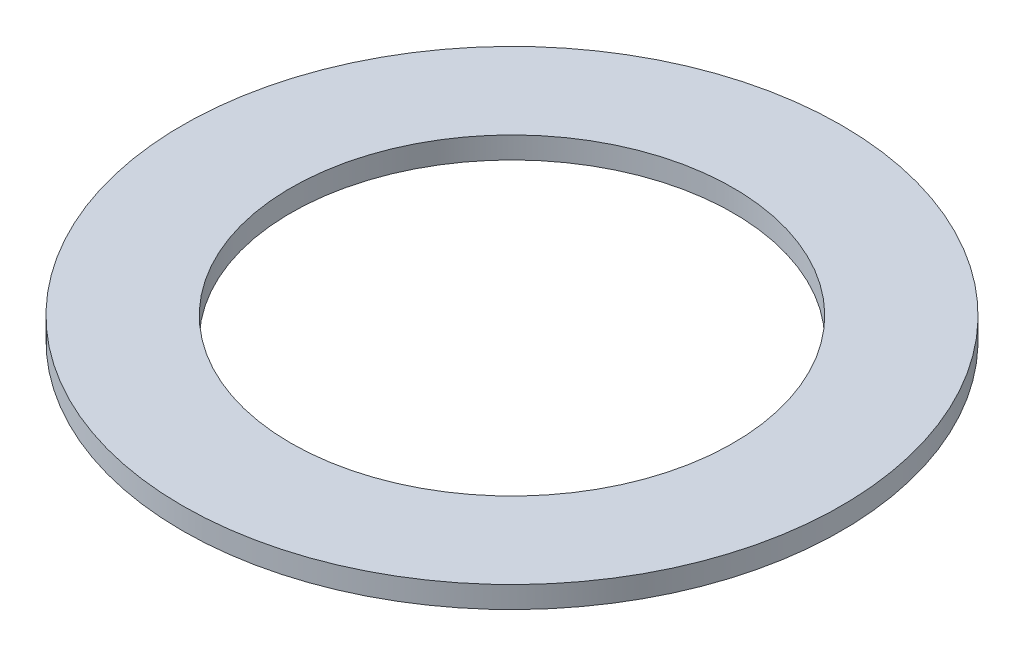
ISO-10303-21;
HEADER;
FILE_DESCRIPTION(('STEP AP214'),'2;1');
FILE_NAME('part.step','',(''),(''),'','','');
FILE_SCHEMA(('AUTOMOTIVE_DESIGN { 1 0 10303 214 1 1 1 1 }'));
ENDSEC;
DATA;
#1=APPLICATION_CONTEXT('core data for automotive mechanical design processes');
#2=APPLICATION_PROTOCOL_DEFINITION('international standard','automotive_design',2000,#1);
#3=PRODUCT_CONTEXT('',#1,'mechanical');
#4=PRODUCT('Part','Part','',(#3));
#5=PRODUCT_RELATED_PRODUCT_CATEGORY('part','',(#4));
#6=PRODUCT_DEFINITION_FORMATION('','',#4);
#7=PRODUCT_DEFINITION_CONTEXT('part definition',#1,'design');
#8=PRODUCT_DEFINITION('design','',#6,#7);
#9=PRODUCT_DEFINITION_SHAPE('','',#8);
#10=(LENGTH_UNIT() NAMED_UNIT(*) SI_UNIT(.MILLI.,.METRE.));
#11=(NAMED_UNIT(*) PLANE_ANGLE_UNIT() SI_UNIT($,.RADIAN.));
#12=(NAMED_UNIT(*) SI_UNIT($,.STERADIAN.) SOLID_ANGLE_UNIT());
#13=UNCERTAINTY_MEASURE_WITH_UNIT(LENGTH_MEASURE(1.E-05),#10,'distance_accuracy_value','');
#14=(GEOMETRIC_REPRESENTATION_CONTEXT(3) GLOBAL_UNCERTAINTY_ASSIGNED_CONTEXT((#13)) GLOBAL_UNIT_ASSIGNED_CONTEXT((#10,
#11,#12)) REPRESENTATION_CONTEXT('',''));
#15=CARTESIAN_POINT('',(0.,0.,0.));
#16=DIRECTION('',(0.,0.,1.));
#17=DIRECTION('',(1.,0.,0.));
#18=AXIS2_PLACEMENT_3D('',#15,#16,#17);
#19=CARTESIAN_POINT('',(0.,0.5,0.));
#20=DIRECTION('',(0.,1.,0.));
#21=DIRECTION('',(0.,0.,1.));
#22=AXIS2_PLACEMENT_3D('',#19,#20,#21);
#23=PLANE('',#22);
#24=CARTESIAN_POINT('',(0.,0.5,0.));
#25=DIRECTION('',(0.,1.,0.));
#26=DIRECTION('',(0.,0.,1.));
#27=AXIS2_PLACEMENT_3D('',#24,#25,#26);
#28=CIRCLE('',#27,7.6);
#29=CARTESIAN_POINT('',(0.,0.5,7.6));
#30=VERTEX_POINT('',#29);
#31=EDGE_CURVE('E10',#30,#30,#28,.T.);
#32=ORIENTED_EDGE('',*,*,#31,.T.);
#33=EDGE_LOOP('',(#32));
#34=FACE_BOUND('',#33,.T.);
#35=CARTESIAN_POINT('',(0.,0.5,0.));
#36=DIRECTION('',(0.,1.,0.));
#37=DIRECTION('',(0.,0.,1.));
#38=AXIS2_PLACEMENT_3D('',#35,#36,#37);
#39=CIRCLE('',#38,5.1);
#40=CARTESIAN_POINT('',(0.,0.5,5.1));
#41=VERTEX_POINT('',#40);
#42=EDGE_CURVE('E54',#41,#41,#39,.T.);
#43=ORIENTED_EDGE('',*,*,#42,.F.);
#44=EDGE_LOOP('',(#43));
#45=FACE_BOUND('',#44,.T.);
#46=ADVANCED_FACE('F41',(#34,#45),#23,.T.);
#47=CARTESIAN_POINT('',(0.,0.,0.));
#48=DIRECTION('',(0.,1.,0.));
#49=DIRECTION('',(0.,0.,1.));
#50=AXIS2_PLACEMENT_3D('',#47,#48,#49);
#51=PLANE('',#50);
#52=CARTESIAN_POINT('',(0.,0.,0.));
#53=DIRECTION('',(0.,1.,0.));
#54=DIRECTION('',(0.,0.,1.));
#55=AXIS2_PLACEMENT_3D('',#52,#53,#54);
#56=CIRCLE('',#55,7.6);
#57=CARTESIAN_POINT('',(0.,0.,7.6));
#58=VERTEX_POINT('',#57);
#59=EDGE_CURVE('E45',#58,#58,#56,.T.);
#60=ORIENTED_EDGE('',*,*,#59,.F.);
#61=EDGE_LOOP('',(#60));
#62=FACE_BOUND('',#61,.T.);
#63=CARTESIAN_POINT('',(0.,0.,0.));
#64=DIRECTION('',(0.,1.,0.));
#65=DIRECTION('',(0.,0.,1.));
#66=AXIS2_PLACEMENT_3D('',#63,#64,#65);
#67=CIRCLE('',#66,5.1);
#68=CARTESIAN_POINT('',(0.,0.,5.1));
#69=VERTEX_POINT('',#68);
#70=EDGE_CURVE('E56',#69,#69,#67,.T.);
#71=ORIENTED_EDGE('',*,*,#70,.T.);
#72=EDGE_LOOP('',(#71));
#73=FACE_BOUND('',#72,.T.);
#74=ADVANCED_FACE('F68',(#62,#73),#51,.F.);
#75=CARTESIAN_POINT('',(0.,0.5,0.));
#76=DIRECTION('',(0.,-1.,0.));
#77=DIRECTION('',(0.,0.,-1.));
#78=AXIS2_PLACEMENT_3D('',#75,#76,#77);
#79=CYLINDRICAL_SURFACE('',#78,7.6);
#80=ORIENTED_EDGE('',*,*,#31,.F.);
#81=EDGE_LOOP('',(#80));
#82=FACE_BOUND('',#81,.T.);
#83=ORIENTED_EDGE('',*,*,#59,.T.);
#84=EDGE_LOOP('',(#83));
#85=FACE_BOUND('',#84,.T.);
#86=ADVANCED_FACE('F43',(#82,#85),#79,.T.);
#87=CARTESIAN_POINT('',(0.,0.5,0.));
#88=DIRECTION('',(0.,-1.,0.));
#89=DIRECTION('',(0.,0.,-1.));
#90=AXIS2_PLACEMENT_3D('',#87,#88,#89);
#91=CYLINDRICAL_SURFACE('',#90,5.1);
#92=ORIENTED_EDGE('',*,*,#42,.T.);
#93=EDGE_LOOP('',(#92));
#94=FACE_BOUND('',#93,.T.);
#95=ORIENTED_EDGE('',*,*,#70,.F.);
#96=EDGE_LOOP('',(#95));
#97=FACE_BOUND('',#96,.T.);
#98=ADVANCED_FACE('F64',(#94,#97),#91,.F.);
#99=CLOSED_SHELL('',(#46,#74,#86,#98));
#100=MANIFOLD_SOLID_BREP('B2',#99);
#101=ADVANCED_BREP_SHAPE_REPRESENTATION('',(#18,#100),#14);
#102=SHAPE_DEFINITION_REPRESENTATION(#9,#101);
ENDSEC;
END-ISO-10303-21;
